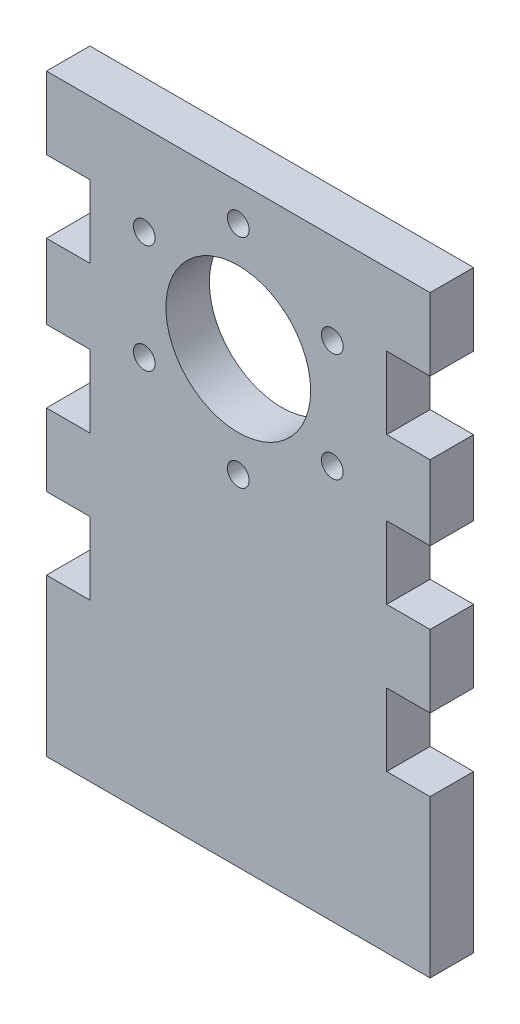
ISO-10303-21;
HEADER;
FILE_DESCRIPTION(('STEP AP214'),'2;1');
FILE_NAME('part.step','',(''),(''),'','','');
FILE_SCHEMA(('AUTOMOTIVE_DESIGN { 1 0 10303 214 1 1 1 1 }'));
ENDSEC;
DATA;
#1=APPLICATION_CONTEXT('core data for automotive mechanical design processes');
#2=APPLICATION_PROTOCOL_DEFINITION('international standard','automotive_design',2000,#1);
#3=PRODUCT_CONTEXT('',#1,'mechanical');
#4=PRODUCT('Part','Part','',(#3));
#5=PRODUCT_RELATED_PRODUCT_CATEGORY('part','',(#4));
#6=PRODUCT_DEFINITION_FORMATION('','',#4);
#7=PRODUCT_DEFINITION_CONTEXT('part definition',#1,'design');
#8=PRODUCT_DEFINITION('design','',#6,#7);
#9=PRODUCT_DEFINITION_SHAPE('','',#8);
#10=(LENGTH_UNIT() NAMED_UNIT(*) SI_UNIT(.MILLI.,.METRE.));
#11=(NAMED_UNIT(*) PLANE_ANGLE_UNIT() SI_UNIT($,.RADIAN.));
#12=(NAMED_UNIT(*) SI_UNIT($,.STERADIAN.) SOLID_ANGLE_UNIT());
#13=UNCERTAINTY_MEASURE_WITH_UNIT(LENGTH_MEASURE(1.E-05),#10,'distance_accuracy_value','');
#14=(GEOMETRIC_REPRESENTATION_CONTEXT(3) GLOBAL_UNCERTAINTY_ASSIGNED_CONTEXT((#13)) GLOBAL_UNIT_ASSIGNED_CONTEXT((#10,
#11,#12)) REPRESENTATION_CONTEXT('',''));
#15=CARTESIAN_POINT('',(0.,0.,0.));
#16=DIRECTION('',(0.,0.,1.));
#17=DIRECTION('',(1.,0.,0.));
#18=AXIS2_PLACEMENT_3D('',#15,#16,#17);
#19=CARTESIAN_POINT('',(0.,0.,3.));
#20=DIRECTION('',(0.,0.,1.));
#21=DIRECTION('',(1.,0.,0.));
#22=AXIS2_PLACEMENT_3D('',#19,#20,#21);
#23=PLANE('',#22);
#24=CARTESIAN_POINT('',(-6.49530237350615,6.75019372810737,3.));
#25=DIRECTION('',(0.,0.,1.));
#26=DIRECTION('',(1.,0.,0.));
#27=AXIS2_PLACEMENT_3D('',#24,#25,#26);
#28=CIRCLE('',#27,0.749999999999999);
#29=CARTESIAN_POINT('',(-5.74530237350615,6.75019372810737,3.));
#30=VERTEX_POINT('',#29);
#31=EDGE_CURVE('E510',#30,#30,#28,.T.);
#32=ORIENTED_EDGE('',*,*,#31,.F.);
#33=EDGE_LOOP('',(#32));
#34=FACE_BOUND('',#33,.T.);
#35=CARTESIAN_POINT('',(6.49519052838329,6.75,3.));
#36=DIRECTION('',(0.,0.,1.));
#37=DIRECTION('',(1.,0.,0.));
#38=AXIS2_PLACEMENT_3D('',#35,#36,#37);
#39=CIRCLE('',#38,0.750000000000005);
#40=CARTESIAN_POINT('',(7.24519052838329,6.75,3.));
#41=VERTEX_POINT('',#40);
#42=EDGE_CURVE('E522',#41,#41,#39,.T.);
#43=ORIENTED_EDGE('',*,*,#42,.F.);
#44=EDGE_LOOP('',(#43));
#45=FACE_BOUND('',#44,.T.);
#46=CARTESIAN_POINT('',(0.,18.,3.));
#47=DIRECTION('',(0.,0.,1.));
#48=DIRECTION('',(1.,0.,0.));
#49=AXIS2_PLACEMENT_3D('',#46,#47,#48);
#50=CIRCLE('',#49,0.750000000000002);
#51=CARTESIAN_POINT('',(0.750000000000002,18.,3.));
#52=VERTEX_POINT('',#51);
#53=EDGE_CURVE('E534',#52,#52,#50,.T.);
#54=ORIENTED_EDGE('',*,*,#53,.F.);
#55=EDGE_LOOP('',(#54));
#56=FACE_BOUND('',#55,.T.);
#57=DIRECTION('',(0.,1.,0.));
#58=VECTOR('',#57,1.);
#59=CARTESIAN_POINT('',(13.25,-9.65,3.));
#60=LINE('',#59,#58);
#61=CARTESIAN_POINT('',(13.25,-20.5,3.));
#62=VERTEX_POINT('',#61);
#63=CARTESIAN_POINT('',(13.25,-9.65,3.));
#64=VERTEX_POINT('',#63);
#65=EDGE_CURVE('E304',#62,#64,#60,.T.);
#66=ORIENTED_EDGE('',*,*,#65,.T.);
#67=DIRECTION('',(-1.,0.,0.));
#68=VECTOR('',#67,1.);
#69=CARTESIAN_POINT('',(10.25,-9.65000000000001,3.));
#70=LINE('',#69,#68);
#71=CARTESIAN_POINT('',(10.25,-9.65000000000001,3.));
#72=VERTEX_POINT('',#71);
#73=EDGE_CURVE('E152',#64,#72,#70,.T.);
#74=ORIENTED_EDGE('',*,*,#73,.T.);
#75=DIRECTION('',(0.,1.,0.));
#76=VECTOR('',#75,1.);
#77=CARTESIAN_POINT('',(10.25,-4.65,3.));
#78=LINE('',#77,#76);
#79=CARTESIAN_POINT('',(10.25,-4.65,3.));
#80=VERTEX_POINT('',#79);
#81=EDGE_CURVE('E379',#72,#80,#78,.T.);
#82=ORIENTED_EDGE('',*,*,#81,.T.);
#83=DIRECTION('',(1.,0.,0.));
#84=VECTOR('',#83,1.);
#85=CARTESIAN_POINT('',(13.25,-4.65,3.));
#86=LINE('',#85,#84);
#87=CARTESIAN_POINT('',(13.25,-4.65,3.));
#88=VERTEX_POINT('',#87);
#89=EDGE_CURVE('E398',#80,#88,#86,.T.);
#90=ORIENTED_EDGE('',*,*,#89,.T.);
#91=DIRECTION('',(0.,1.,0.));
#92=VECTOR('',#91,1.);
#93=CARTESIAN_POINT('',(13.25,0.349999999999997,3.));
#94=LINE('',#93,#92);
#95=CARTESIAN_POINT('',(13.25,0.349999999999997,3.));
#96=VERTEX_POINT('',#95);
#97=EDGE_CURVE('E395',#88,#96,#94,.T.);
#98=ORIENTED_EDGE('',*,*,#97,.T.);
#99=DIRECTION('',(-1.,0.,0.));
#100=VECTOR('',#99,1.);
#101=CARTESIAN_POINT('',(10.25,0.349999999999997,3.));
#102=LINE('',#101,#100);
#103=CARTESIAN_POINT('',(10.25,0.349999999999997,3.));
#104=VERTEX_POINT('',#103);
#105=EDGE_CURVE('E397',#96,#104,#102,.T.);
#106=ORIENTED_EDGE('',*,*,#105,.T.);
#107=DIRECTION('',(0.,1.,0.));
#108=VECTOR('',#107,1.);
#109=CARTESIAN_POINT('',(10.25,5.35,3.));
#110=LINE('',#109,#108);
#111=CARTESIAN_POINT('',(10.25,5.35,3.));
#112=VERTEX_POINT('',#111);
#113=EDGE_CURVE('E400',#104,#112,#110,.T.);
#114=ORIENTED_EDGE('',*,*,#113,.T.);
#115=DIRECTION('',(1.,0.,0.));
#116=VECTOR('',#115,1.);
#117=CARTESIAN_POINT('',(13.25,5.35,3.));
#118=LINE('',#117,#116);
#119=CARTESIAN_POINT('',(13.25,5.35,3.));
#120=VERTEX_POINT('',#119);
#121=EDGE_CURVE('E406',#112,#120,#118,.T.);
#122=ORIENTED_EDGE('',*,*,#121,.T.);
#123=DIRECTION('',(0.,1.,0.));
#124=VECTOR('',#123,1.);
#125=CARTESIAN_POINT('',(13.25,10.5,3.));
#126=LINE('',#125,#124);
#127=CARTESIAN_POINT('',(13.25,10.5,3.));
#128=VERTEX_POINT('',#127);
#129=EDGE_CURVE('E408',#120,#128,#126,.T.);
#130=ORIENTED_EDGE('',*,*,#129,.T.);
#131=DIRECTION('',(-1.,0.,0.));
#132=VECTOR('',#131,1.);
#133=CARTESIAN_POINT('',(10.25,10.5,3.));
#134=LINE('',#133,#132);
#135=CARTESIAN_POINT('',(10.25,10.5,3.));
#136=VERTEX_POINT('',#135);
#137=EDGE_CURVE('E410',#128,#136,#134,.T.);
#138=ORIENTED_EDGE('',*,*,#137,.T.);
#139=DIRECTION('',(0.,1.,0.));
#140=VECTOR('',#139,1.);
#141=CARTESIAN_POINT('',(10.25,15.5,3.));
#142=LINE('',#141,#140);
#143=CARTESIAN_POINT('',(10.25,15.5,3.));
#144=VERTEX_POINT('',#143);
#145=EDGE_CURVE('E412',#136,#144,#142,.T.);
#146=ORIENTED_EDGE('',*,*,#145,.T.);
#147=DIRECTION('',(1.,0.,0.));
#148=VECTOR('',#147,1.);
#149=CARTESIAN_POINT('',(13.25,15.5,3.));
#150=LINE('',#149,#148);
#151=CARTESIAN_POINT('',(13.25,15.5,3.));
#152=VERTEX_POINT('',#151);
#153=EDGE_CURVE('E414',#144,#152,#150,.T.);
#154=ORIENTED_EDGE('',*,*,#153,.T.);
#155=DIRECTION('',(0.,1.,0.));
#156=VECTOR('',#155,1.);
#157=CARTESIAN_POINT('',(13.25,20.5,3.));
#158=LINE('',#157,#156);
#159=CARTESIAN_POINT('',(13.25,20.5,3.));
#160=VERTEX_POINT('',#159);
#161=EDGE_CURVE('E416',#152,#160,#158,.T.);
#162=ORIENTED_EDGE('',*,*,#161,.T.);
#163=DIRECTION('',(-1.,0.,0.));
#164=VECTOR('',#163,1.);
#165=CARTESIAN_POINT('',(-13.25,20.5,3.));
#166=LINE('',#165,#164);
#167=CARTESIAN_POINT('',(-13.25,20.5,3.));
#168=VERTEX_POINT('',#167);
#169=EDGE_CURVE('E418',#160,#168,#166,.T.);
#170=ORIENTED_EDGE('',*,*,#169,.T.);
#171=DIRECTION('',(0.,-1.,0.));
#172=VECTOR('',#171,1.);
#173=CARTESIAN_POINT('',(-13.25,20.5,3.));
#174=LINE('',#173,#172);
#175=CARTESIAN_POINT('',(-13.25,15.5,3.));
#176=VERTEX_POINT('',#175);
#177=EDGE_CURVE('E420',#168,#176,#174,.T.);
#178=ORIENTED_EDGE('',*,*,#177,.T.);
#179=DIRECTION('',(1.,0.,0.));
#180=VECTOR('',#179,1.);
#181=CARTESIAN_POINT('',(-13.25,15.5,3.));
#182=LINE('',#181,#180);
#183=CARTESIAN_POINT('',(-10.25,15.5,3.));
#184=VERTEX_POINT('',#183);
#185=EDGE_CURVE('E422',#176,#184,#182,.T.);
#186=ORIENTED_EDGE('',*,*,#185,.T.);
#187=DIRECTION('',(0.,-1.,0.));
#188=VECTOR('',#187,1.);
#189=CARTESIAN_POINT('',(-10.25,15.5,3.));
#190=LINE('',#189,#188);
#191=CARTESIAN_POINT('',(-10.25,10.5,3.));
#192=VERTEX_POINT('',#191);
#193=EDGE_CURVE('E424',#184,#192,#190,.T.);
#194=ORIENTED_EDGE('',*,*,#193,.T.);
#195=DIRECTION('',(-1.,0.,0.));
#196=VECTOR('',#195,1.);
#197=CARTESIAN_POINT('',(-10.25,10.5,3.));
#198=LINE('',#197,#196);
#199=CARTESIAN_POINT('',(-13.25,10.5,3.));
#200=VERTEX_POINT('',#199);
#201=EDGE_CURVE('E426',#192,#200,#198,.T.);
#202=ORIENTED_EDGE('',*,*,#201,.T.);
#203=DIRECTION('',(0.,-1.,0.));
#204=VECTOR('',#203,1.);
#205=CARTESIAN_POINT('',(-13.25,10.5,3.));
#206=LINE('',#205,#204);
#207=CARTESIAN_POINT('',(-13.25,5.35,3.));
#208=VERTEX_POINT('',#207);
#209=EDGE_CURVE('E428',#200,#208,#206,.T.);
#210=ORIENTED_EDGE('',*,*,#209,.T.);
#211=DIRECTION('',(1.,0.,0.));
#212=VECTOR('',#211,1.);
#213=CARTESIAN_POINT('',(-13.25,5.35,3.));
#214=LINE('',#213,#212);
#215=CARTESIAN_POINT('',(-10.25,5.35,3.));
#216=VERTEX_POINT('',#215);
#217=EDGE_CURVE('E430',#208,#216,#214,.T.);
#218=ORIENTED_EDGE('',*,*,#217,.T.);
#219=DIRECTION('',(0.,-1.,0.));
#220=VECTOR('',#219,1.);
#221=CARTESIAN_POINT('',(-10.25,5.35,3.));
#222=LINE('',#221,#220);
#223=CARTESIAN_POINT('',(-10.25,0.349999999999994,3.));
#224=VERTEX_POINT('',#223);
#225=EDGE_CURVE('E432',#216,#224,#222,.T.);
#226=ORIENTED_EDGE('',*,*,#225,.T.);
#227=DIRECTION('',(-1.,0.,0.));
#228=VECTOR('',#227,1.);
#229=CARTESIAN_POINT('',(-10.25,0.349999999999994,3.));
#230=LINE('',#229,#228);
#231=CARTESIAN_POINT('',(-13.25,0.349999999999994,3.));
#232=VERTEX_POINT('',#231);
#233=EDGE_CURVE('E434',#224,#232,#230,.T.);
#234=ORIENTED_EDGE('',*,*,#233,.T.);
#235=DIRECTION('',(0.,-1.,0.));
#236=VECTOR('',#235,1.);
#237=CARTESIAN_POINT('',(-13.25,0.349999999999994,3.));
#238=LINE('',#237,#236);
#239=CARTESIAN_POINT('',(-13.25,-4.65000000000001,3.));
#240=VERTEX_POINT('',#239);
#241=EDGE_CURVE('E436',#232,#240,#238,.T.);
#242=ORIENTED_EDGE('',*,*,#241,.T.);
#243=DIRECTION('',(1.,0.,0.));
#244=VECTOR('',#243,1.);
#245=CARTESIAN_POINT('',(-13.25,-4.65000000000001,3.));
#246=LINE('',#245,#244);
#247=CARTESIAN_POINT('',(-10.25,-4.65000000000001,3.));
#248=VERTEX_POINT('',#247);
#249=EDGE_CURVE('E438',#240,#248,#246,.T.);
#250=ORIENTED_EDGE('',*,*,#249,.T.);
#251=DIRECTION('',(0.,-1.,0.));
#252=VECTOR('',#251,1.);
#253=CARTESIAN_POINT('',(-10.25,-4.65000000000001,3.));
#254=LINE('',#253,#252);
#255=CARTESIAN_POINT('',(-10.25,-9.65000000000001,3.));
#256=VERTEX_POINT('',#255);
#257=EDGE_CURVE('E231',#248,#256,#254,.T.);
#258=ORIENTED_EDGE('',*,*,#257,.T.);
#259=DIRECTION('',(-1.,0.,0.));
#260=VECTOR('',#259,1.);
#261=CARTESIAN_POINT('',(-10.25,-9.65000000000001,3.));
#262=LINE('',#261,#260);
#263=CARTESIAN_POINT('',(-13.25,-9.65000000000001,3.));
#264=VERTEX_POINT('',#263);
#265=EDGE_CURVE('E225',#256,#264,#262,.T.);
#266=ORIENTED_EDGE('',*,*,#265,.T.);
#267=DIRECTION('',(0.,-1.,0.));
#268=VECTOR('',#267,1.);
#269=CARTESIAN_POINT('',(-13.25,-9.65000000000001,3.));
#270=LINE('',#269,#268);
#271=CARTESIAN_POINT('',(-13.25,-20.5,3.));
#272=VERTEX_POINT('',#271);
#273=EDGE_CURVE('E229',#264,#272,#270,.T.);
#274=ORIENTED_EDGE('',*,*,#273,.T.);
#275=DIRECTION('',(1.,0.,0.));
#276=VECTOR('',#275,1.);
#277=CARTESIAN_POINT('',(-13.25,-20.5,3.));
#278=LINE('',#277,#276);
#279=EDGE_CURVE('E49',#272,#62,#278,.T.);
#280=ORIENTED_EDGE('',*,*,#279,.T.);
#281=EDGE_LOOP('',(#66,#74,#82,#90,#98,#106,#114,#122,#130,#138,#146,#154,#162,#170,#178,#186,
#194,#202,#210,#218,#226,#234,#242,#250,#258,#266,#274,#280));
#282=FACE_BOUND('',#281,.T.);
#283=CARTESIAN_POINT('',(0.,10.5,3.));
#284=DIRECTION('',(0.,0.,1.));
#285=DIRECTION('',(1.,0.,0.));
#286=AXIS2_PLACEMENT_3D('',#283,#284,#285);
#287=CIRCLE('',#286,5.);
#288=CARTESIAN_POINT('',(5.,10.5,3.));
#289=VERTEX_POINT('',#288);
#290=EDGE_CURVE('E253',#289,#289,#287,.T.);
#291=ORIENTED_EDGE('',*,*,#290,.F.);
#292=EDGE_LOOP('',(#291));
#293=FACE_BOUND('',#292,.T.);
#294=CARTESIAN_POINT('',(6.49530237350615,14.2498062718926,3.));
#295=DIRECTION('',(0.,0.,1.));
#296=DIRECTION('',(1.,0.,0.));
#297=AXIS2_PLACEMENT_3D('',#294,#295,#296);
#298=CIRCLE('',#297,0.750000000000002);
#299=CARTESIAN_POINT('',(7.24530237350616,14.2498062718926,3.));
#300=VERTEX_POINT('',#299);
#301=EDGE_CURVE('E528',#300,#300,#298,.T.);
#302=ORIENTED_EDGE('',*,*,#301,.F.);
#303=EDGE_LOOP('',(#302));
#304=FACE_BOUND('',#303,.T.);
#305=CARTESIAN_POINT('',(0.,3.,3.));
#306=DIRECTION('',(0.,0.,1.));
#307=DIRECTION('',(1.,0.,0.));
#308=AXIS2_PLACEMENT_3D('',#305,#306,#307);
#309=CIRCLE('',#308,0.750000000000002);
#310=CARTESIAN_POINT('',(0.750000000000004,3.,3.));
#311=VERTEX_POINT('',#310);
#312=EDGE_CURVE('E516',#311,#311,#309,.T.);
#313=ORIENTED_EDGE('',*,*,#312,.F.);
#314=EDGE_LOOP('',(#313));
#315=FACE_BOUND('',#314,.T.);
#316=CARTESIAN_POINT('',(-6.49519052838329,14.25,3.));
#317=DIRECTION('',(0.,0.,1.));
#318=DIRECTION('',(1.,0.,0.));
#319=AXIS2_PLACEMENT_3D('',#316,#317,#318);
#320=CIRCLE('',#319,0.750000000000002);
#321=CARTESIAN_POINT('',(-5.74519052838329,14.25,3.));
#322=VERTEX_POINT('',#321);
#323=EDGE_CURVE('E501',#322,#322,#320,.T.);
#324=ORIENTED_EDGE('',*,*,#323,.F.);
#325=EDGE_LOOP('',(#324));
#326=FACE_BOUND('',#325,.T.);
#327=ADVANCED_FACE('F32',(#34,#45,#56,#282,#293,#304,#315,#326),#23,.T.);
#328=CARTESIAN_POINT('',(0.,0.,0.));
#329=DIRECTION('',(0.,0.,1.));
#330=DIRECTION('',(1.,0.,0.));
#331=AXIS2_PLACEMENT_3D('',#328,#329,#330);
#332=PLANE('',#331);
#333=DIRECTION('',(0.,1.,0.));
#334=VECTOR('',#333,1.);
#335=CARTESIAN_POINT('',(13.25,-9.65,0.));
#336=LINE('',#335,#334);
#337=CARTESIAN_POINT('',(13.25,-20.5,0.));
#338=VERTEX_POINT('',#337);
#339=CARTESIAN_POINT('',(13.25,-9.65,0.));
#340=VERTEX_POINT('',#339);
#341=EDGE_CURVE('E249',#338,#340,#336,.T.);
#342=ORIENTED_EDGE('',*,*,#341,.F.);
#343=DIRECTION('',(1.,0.,0.));
#344=VECTOR('',#343,1.);
#345=CARTESIAN_POINT('',(-13.25,-20.5,0.));
#346=LINE('',#345,#344);
#347=CARTESIAN_POINT('',(-13.25,-20.5,0.));
#348=VERTEX_POINT('',#347);
#349=EDGE_CURVE('E144',#348,#338,#346,.T.);
#350=ORIENTED_EDGE('',*,*,#349,.F.);
#351=DIRECTION('',(0.,-1.,0.));
#352=VECTOR('',#351,1.);
#353=CARTESIAN_POINT('',(-13.25,-9.65000000000001,0.));
#354=LINE('',#353,#352);
#355=CARTESIAN_POINT('',(-13.25,-9.65000000000001,0.));
#356=VERTEX_POINT('',#355);
#357=EDGE_CURVE('E138',#356,#348,#354,.T.);
#358=ORIENTED_EDGE('',*,*,#357,.F.);
#359=DIRECTION('',(-1.,0.,0.));
#360=VECTOR('',#359,1.);
#361=CARTESIAN_POINT('',(-10.25,-9.65000000000001,0.));
#362=LINE('',#361,#360);
#363=CARTESIAN_POINT('',(-10.25,-9.65000000000001,0.));
#364=VERTEX_POINT('',#363);
#365=EDGE_CURVE('E239',#364,#356,#362,.T.);
#366=ORIENTED_EDGE('',*,*,#365,.F.);
#367=DIRECTION('',(0.,-1.,0.));
#368=VECTOR('',#367,1.);
#369=CARTESIAN_POINT('',(-10.25,-4.65000000000001,0.));
#370=LINE('',#369,#368);
#371=CARTESIAN_POINT('',(-10.25,-4.65000000000001,0.));
#372=VERTEX_POINT('',#371);
#373=EDGE_CURVE('E299',#372,#364,#370,.T.);
#374=ORIENTED_EDGE('',*,*,#373,.F.);
#375=DIRECTION('',(1.,0.,0.));
#376=VECTOR('',#375,1.);
#377=CARTESIAN_POINT('',(-13.25,-4.65000000000001,0.));
#378=LINE('',#377,#376);
#379=CARTESIAN_POINT('',(-13.25,-4.65000000000001,0.));
#380=VERTEX_POINT('',#379);
#381=EDGE_CURVE('E297',#380,#372,#378,.T.);
#382=ORIENTED_EDGE('',*,*,#381,.F.);
#383=DIRECTION('',(0.,-1.,0.));
#384=VECTOR('',#383,1.);
#385=CARTESIAN_POINT('',(-13.25,0.349999999999994,0.));
#386=LINE('',#385,#384);
#387=CARTESIAN_POINT('',(-13.25,0.349999999999994,0.));
#388=VERTEX_POINT('',#387);
#389=EDGE_CURVE('E295',#388,#380,#386,.T.);
#390=ORIENTED_EDGE('',*,*,#389,.F.);
#391=DIRECTION('',(-1.,0.,0.));
#392=VECTOR('',#391,1.);
#393=CARTESIAN_POINT('',(-10.25,0.349999999999994,0.));
#394=LINE('',#393,#392);
#395=CARTESIAN_POINT('',(-10.25,0.349999999999994,0.));
#396=VERTEX_POINT('',#395);
#397=EDGE_CURVE('E293',#396,#388,#394,.T.);
#398=ORIENTED_EDGE('',*,*,#397,.F.);
#399=DIRECTION('',(0.,-1.,0.));
#400=VECTOR('',#399,1.);
#401=CARTESIAN_POINT('',(-10.25,5.35,0.));
#402=LINE('',#401,#400);
#403=CARTESIAN_POINT('',(-10.25,5.35,0.));
#404=VERTEX_POINT('',#403);
#405=EDGE_CURVE('E291',#404,#396,#402,.T.);
#406=ORIENTED_EDGE('',*,*,#405,.F.);
#407=DIRECTION('',(1.,0.,0.));
#408=VECTOR('',#407,1.);
#409=CARTESIAN_POINT('',(-13.25,5.35,0.));
#410=LINE('',#409,#408);
#411=CARTESIAN_POINT('',(-13.25,5.35,0.));
#412=VERTEX_POINT('',#411);
#413=EDGE_CURVE('E289',#412,#404,#410,.T.);
#414=ORIENTED_EDGE('',*,*,#413,.F.);
#415=DIRECTION('',(0.,-1.,0.));
#416=VECTOR('',#415,1.);
#417=CARTESIAN_POINT('',(-13.25,10.5,0.));
#418=LINE('',#417,#416);
#419=CARTESIAN_POINT('',(-13.25,10.5,0.));
#420=VERTEX_POINT('',#419);
#421=EDGE_CURVE('E287',#420,#412,#418,.T.);
#422=ORIENTED_EDGE('',*,*,#421,.F.);
#423=DIRECTION('',(-1.,0.,0.));
#424=VECTOR('',#423,1.);
#425=CARTESIAN_POINT('',(-10.25,10.5,0.));
#426=LINE('',#425,#424);
#427=CARTESIAN_POINT('',(-10.25,10.5,0.));
#428=VERTEX_POINT('',#427);
#429=EDGE_CURVE('E285',#428,#420,#426,.T.);
#430=ORIENTED_EDGE('',*,*,#429,.F.);
#431=DIRECTION('',(0.,-1.,0.));
#432=VECTOR('',#431,1.);
#433=CARTESIAN_POINT('',(-10.25,15.5,0.));
#434=LINE('',#433,#432);
#435=CARTESIAN_POINT('',(-10.25,15.5,0.));
#436=VERTEX_POINT('',#435);
#437=EDGE_CURVE('E283',#436,#428,#434,.T.);
#438=ORIENTED_EDGE('',*,*,#437,.F.);
#439=DIRECTION('',(1.,0.,0.));
#440=VECTOR('',#439,1.);
#441=CARTESIAN_POINT('',(-13.25,15.5,0.));
#442=LINE('',#441,#440);
#443=CARTESIAN_POINT('',(-13.25,15.5,0.));
#444=VERTEX_POINT('',#443);
#445=EDGE_CURVE('E281',#444,#436,#442,.T.);
#446=ORIENTED_EDGE('',*,*,#445,.F.);
#447=DIRECTION('',(0.,-1.,0.));
#448=VECTOR('',#447,1.);
#449=CARTESIAN_POINT('',(-13.25,20.5,0.));
#450=LINE('',#449,#448);
#451=CARTESIAN_POINT('',(-13.25,20.5,0.));
#452=VERTEX_POINT('',#451);
#453=EDGE_CURVE('E279',#452,#444,#450,.T.);
#454=ORIENTED_EDGE('',*,*,#453,.F.);
#455=DIRECTION('',(-1.,0.,0.));
#456=VECTOR('',#455,1.);
#457=CARTESIAN_POINT('',(-13.25,20.5,0.));
#458=LINE('',#457,#456);
#459=CARTESIAN_POINT('',(13.25,20.5,0.));
#460=VERTEX_POINT('',#459);
#461=EDGE_CURVE('E277',#460,#452,#458,.T.);
#462=ORIENTED_EDGE('',*,*,#461,.F.);
#463=DIRECTION('',(0.,1.,0.));
#464=VECTOR('',#463,1.);
#465=CARTESIAN_POINT('',(13.25,20.5,0.));
#466=LINE('',#465,#464);
#467=CARTESIAN_POINT('',(13.25,15.5,0.));
#468=VERTEX_POINT('',#467);
#469=EDGE_CURVE('E275',#468,#460,#466,.T.);
#470=ORIENTED_EDGE('',*,*,#469,.F.);
#471=DIRECTION('',(1.,0.,0.));
#472=VECTOR('',#471,1.);
#473=CARTESIAN_POINT('',(13.25,15.5,0.));
#474=LINE('',#473,#472);
#475=CARTESIAN_POINT('',(10.25,15.5,0.));
#476=VERTEX_POINT('',#475);
#477=EDGE_CURVE('E273',#476,#468,#474,.T.);
#478=ORIENTED_EDGE('',*,*,#477,.F.);
#479=DIRECTION('',(0.,1.,0.));
#480=VECTOR('',#479,1.);
#481=CARTESIAN_POINT('',(10.25,15.5,0.));
#482=LINE('',#481,#480);
#483=CARTESIAN_POINT('',(10.25,10.5,0.));
#484=VERTEX_POINT('',#483);
#485=EDGE_CURVE('E271',#484,#476,#482,.T.);
#486=ORIENTED_EDGE('',*,*,#485,.F.);
#487=DIRECTION('',(-1.,0.,0.));
#488=VECTOR('',#487,1.);
#489=CARTESIAN_POINT('',(10.25,10.5,0.));
#490=LINE('',#489,#488);
#491=CARTESIAN_POINT('',(13.25,10.5,0.));
#492=VERTEX_POINT('',#491);
#493=EDGE_CURVE('E269',#492,#484,#490,.T.);
#494=ORIENTED_EDGE('',*,*,#493,.F.);
#495=DIRECTION('',(0.,1.,0.));
#496=VECTOR('',#495,1.);
#497=CARTESIAN_POINT('',(13.25,10.5,0.));
#498=LINE('',#497,#496);
#499=CARTESIAN_POINT('',(13.25,5.35,0.));
#500=VERTEX_POINT('',#499);
#501=EDGE_CURVE('E267',#500,#492,#498,.T.);
#502=ORIENTED_EDGE('',*,*,#501,.F.);
#503=DIRECTION('',(1.,0.,0.));
#504=VECTOR('',#503,1.);
#505=CARTESIAN_POINT('',(13.25,5.35,0.));
#506=LINE('',#505,#504);
#507=CARTESIAN_POINT('',(10.25,5.35,0.));
#508=VERTEX_POINT('',#507);
#509=EDGE_CURVE('E265',#508,#500,#506,.T.);
#510=ORIENTED_EDGE('',*,*,#509,.F.);
#511=DIRECTION('',(0.,1.,0.));
#512=VECTOR('',#511,1.);
#513=CARTESIAN_POINT('',(10.25,5.35,0.));
#514=LINE('',#513,#512);
#515=CARTESIAN_POINT('',(10.25,0.349999999999997,0.));
#516=VERTEX_POINT('',#515);
#517=EDGE_CURVE('E263',#516,#508,#514,.T.);
#518=ORIENTED_EDGE('',*,*,#517,.F.);
#519=DIRECTION('',(-1.,0.,0.));
#520=VECTOR('',#519,1.);
#521=CARTESIAN_POINT('',(10.25,0.349999999999997,0.));
#522=LINE('',#521,#520);
#523=CARTESIAN_POINT('',(13.25,0.349999999999997,0.));
#524=VERTEX_POINT('',#523);
#525=EDGE_CURVE('E261',#524,#516,#522,.T.);
#526=ORIENTED_EDGE('',*,*,#525,.F.);
#527=DIRECTION('',(0.,1.,0.));
#528=VECTOR('',#527,1.);
#529=CARTESIAN_POINT('',(13.25,0.349999999999997,0.));
#530=LINE('',#529,#528);
#531=CARTESIAN_POINT('',(13.25,-4.65,0.));
#532=VERTEX_POINT('',#531);
#533=EDGE_CURVE('E259',#532,#524,#530,.T.);
#534=ORIENTED_EDGE('',*,*,#533,.F.);
#535=DIRECTION('',(1.,0.,0.));
#536=VECTOR('',#535,1.);
#537=CARTESIAN_POINT('',(13.25,-4.65,0.));
#538=LINE('',#537,#536);
#539=CARTESIAN_POINT('',(10.25,-4.65,0.));
#540=VERTEX_POINT('',#539);
#541=EDGE_CURVE('E257',#540,#532,#538,.T.);
#542=ORIENTED_EDGE('',*,*,#541,.F.);
#543=DIRECTION('',(0.,1.,0.));
#544=VECTOR('',#543,1.);
#545=CARTESIAN_POINT('',(10.25,-4.65,0.));
#546=LINE('',#545,#544);
#547=CARTESIAN_POINT('',(10.25,-9.65000000000001,0.));
#548=VERTEX_POINT('',#547);
#549=EDGE_CURVE('E255',#548,#540,#546,.T.);
#550=ORIENTED_EDGE('',*,*,#549,.F.);
#551=DIRECTION('',(-1.,0.,0.));
#552=VECTOR('',#551,1.);
#553=CARTESIAN_POINT('',(10.25,-9.65000000000001,0.));
#554=LINE('',#553,#552);
#555=EDGE_CURVE('E252',#340,#548,#554,.T.);
#556=ORIENTED_EDGE('',*,*,#555,.F.);
#557=EDGE_LOOP('',(#342,#350,#358,#366,#374,#382,#390,#398,#406,#414,#422,#430,#438,#446,#454,
#462,#470,#478,#486,#494,#502,#510,#518,#526,#534,#542,#550,#556));
#558=FACE_BOUND('',#557,.T.);
#559=CARTESIAN_POINT('',(0.,10.5,0.));
#560=DIRECTION('',(0.,0.,1.));
#561=DIRECTION('',(1.,0.,0.));
#562=AXIS2_PLACEMENT_3D('',#559,#560,#561);
#563=CIRCLE('',#562,5.);
#564=CARTESIAN_POINT('',(5.,10.5,0.));
#565=VERTEX_POINT('',#564);
#566=EDGE_CURVE('E537',#565,#565,#563,.T.);
#567=ORIENTED_EDGE('',*,*,#566,.T.);
#568=EDGE_LOOP('',(#567));
#569=FACE_BOUND('',#568,.T.);
#570=CARTESIAN_POINT('',(0.,18.,0.));
#571=DIRECTION('',(0.,0.,1.));
#572=DIRECTION('',(1.,0.,0.));
#573=AXIS2_PLACEMENT_3D('',#570,#571,#572);
#574=CIRCLE('',#573,0.750000000000002);
#575=CARTESIAN_POINT('',(0.750000000000002,18.,0.));
#576=VERTEX_POINT('',#575);
#577=EDGE_CURVE('E531',#576,#576,#574,.T.);
#578=ORIENTED_EDGE('',*,*,#577,.T.);
#579=EDGE_LOOP('',(#578));
#580=FACE_BOUND('',#579,.T.);
#581=CARTESIAN_POINT('',(6.49530237350615,14.2498062718926,0.));
#582=DIRECTION('',(0.,0.,1.));
#583=DIRECTION('',(1.,0.,0.));
#584=AXIS2_PLACEMENT_3D('',#581,#582,#583);
#585=CIRCLE('',#584,0.750000000000002);
#586=CARTESIAN_POINT('',(7.24530237350616,14.2498062718926,0.));
#587=VERTEX_POINT('',#586);
#588=EDGE_CURVE('E525',#587,#587,#585,.T.);
#589=ORIENTED_EDGE('',*,*,#588,.T.);
#590=EDGE_LOOP('',(#589));
#591=FACE_BOUND('',#590,.T.);
#592=CARTESIAN_POINT('',(6.49519052838329,6.75,0.));
#593=DIRECTION('',(0.,0.,1.));
#594=DIRECTION('',(1.,0.,0.));
#595=AXIS2_PLACEMENT_3D('',#592,#593,#594);
#596=CIRCLE('',#595,0.750000000000005);
#597=CARTESIAN_POINT('',(7.24519052838329,6.75,0.));
#598=VERTEX_POINT('',#597);
#599=EDGE_CURVE('E519',#598,#598,#596,.T.);
#600=ORIENTED_EDGE('',*,*,#599,.T.);
#601=EDGE_LOOP('',(#600));
#602=FACE_BOUND('',#601,.T.);
#603=CARTESIAN_POINT('',(0.,3.,0.));
#604=DIRECTION('',(0.,0.,1.));
#605=DIRECTION('',(1.,0.,0.));
#606=AXIS2_PLACEMENT_3D('',#603,#604,#605);
#607=CIRCLE('',#606,0.750000000000002);
#608=CARTESIAN_POINT('',(0.750000000000004,3.,0.));
#609=VERTEX_POINT('',#608);
#610=EDGE_CURVE('E513',#609,#609,#607,.T.);
#611=ORIENTED_EDGE('',*,*,#610,.T.);
#612=EDGE_LOOP('',(#611));
#613=FACE_BOUND('',#612,.T.);
#614=CARTESIAN_POINT('',(-6.49530237350615,6.75019372810737,0.));
#615=DIRECTION('',(0.,0.,1.));
#616=DIRECTION('',(1.,0.,0.));
#617=AXIS2_PLACEMENT_3D('',#614,#615,#616);
#618=CIRCLE('',#617,0.749999999999999);
#619=CARTESIAN_POINT('',(-5.74530237350615,6.75019372810737,0.));
#620=VERTEX_POINT('',#619);
#621=EDGE_CURVE('E507',#620,#620,#618,.T.);
#622=ORIENTED_EDGE('',*,*,#621,.T.);
#623=EDGE_LOOP('',(#622));
#624=FACE_BOUND('',#623,.T.);
#625=CARTESIAN_POINT('',(-6.49519052838329,14.25,0.));
#626=DIRECTION('',(0.,0.,1.));
#627=DIRECTION('',(1.,0.,0.));
#628=AXIS2_PLACEMENT_3D('',#625,#626,#627);
#629=CIRCLE('',#628,0.750000000000002);
#630=CARTESIAN_POINT('',(-5.74519052838329,14.25,0.));
#631=VERTEX_POINT('',#630);
#632=EDGE_CURVE('E504',#631,#631,#629,.T.);
#633=ORIENTED_EDGE('',*,*,#632,.T.);
#634=EDGE_LOOP('',(#633));
#635=FACE_BOUND('',#634,.T.);
#636=ADVANCED_FACE('F383',(#558,#569,#580,#591,#602,#613,#624,#635),#332,.F.);
#637=CARTESIAN_POINT('',(13.25,-9.65,3.));
#638=DIRECTION('',(-1.,0.,0.));
#639=DIRECTION('',(0.,0.,1.));
#640=AXIS2_PLACEMENT_3D('',#637,#638,#639);
#641=PLANE('',#640);
#642=ORIENTED_EDGE('',*,*,#341,.T.);
#643=DIRECTION('',(0.,0.,-1.));
#644=VECTOR('',#643,1.);
#645=CARTESIAN_POINT('',(13.25,-9.65,3.));
#646=LINE('',#645,#644);
#647=EDGE_CURVE('E11',#64,#340,#646,.T.);
#648=ORIENTED_EDGE('',*,*,#647,.F.);
#649=ORIENTED_EDGE('',*,*,#65,.F.);
#650=DIRECTION('',(0.,0.,-1.));
#651=VECTOR('',#650,1.);
#652=CARTESIAN_POINT('',(13.25,-20.5,3.));
#653=LINE('',#652,#651);
#654=EDGE_CURVE('E245',#62,#338,#653,.T.);
#655=ORIENTED_EDGE('',*,*,#654,.T.);
#656=EDGE_LOOP('',(#642,#648,#649,#655));
#657=FACE_BOUND('',#656,.T.);
#658=ADVANCED_FACE('F34',(#657),#641,.F.);
#659=CARTESIAN_POINT('',(10.25,-9.65000000000001,3.));
#660=DIRECTION('',(0.,-1.,0.));
#661=DIRECTION('',(1.,0.,0.));
#662=AXIS2_PLACEMENT_3D('',#659,#660,#661);
#663=PLANE('',#662);
#664=ORIENTED_EDGE('',*,*,#555,.T.);
#665=DIRECTION('',(0.,0.,-1.));
#666=VECTOR('',#665,1.);
#667=CARTESIAN_POINT('',(10.25,-9.65000000000001,3.));
#668=LINE('',#667,#666);
#669=EDGE_CURVE('E41',#72,#548,#668,.T.);
#670=ORIENTED_EDGE('',*,*,#669,.F.);
#671=ORIENTED_EDGE('',*,*,#73,.F.);
#672=ORIENTED_EDGE('',*,*,#647,.T.);
#673=EDGE_LOOP('',(#664,#670,#671,#672));
#674=FACE_BOUND('',#673,.T.);
#675=ADVANCED_FACE('F834',(#674),#663,.F.);
#676=CARTESIAN_POINT('',(10.25,-4.65,3.));
#677=DIRECTION('',(-1.,0.,0.));
#678=DIRECTION('',(0.,0.,1.));
#679=AXIS2_PLACEMENT_3D('',#676,#677,#678);
#680=PLANE('',#679);
#681=ORIENTED_EDGE('',*,*,#549,.T.);
#682=DIRECTION('',(0.,0.,-1.));
#683=VECTOR('',#682,1.);
#684=CARTESIAN_POINT('',(10.25,-4.65,3.));
#685=LINE('',#684,#683);
#686=EDGE_CURVE('E371',#80,#540,#685,.T.);
#687=ORIENTED_EDGE('',*,*,#686,.F.);
#688=ORIENTED_EDGE('',*,*,#81,.F.);
#689=ORIENTED_EDGE('',*,*,#669,.T.);
#690=EDGE_LOOP('',(#681,#687,#688,#689));
#691=FACE_BOUND('',#690,.T.);
#692=ADVANCED_FACE('F377',(#691),#680,.F.);
#693=CARTESIAN_POINT('',(13.25,-4.65,3.));
#694=DIRECTION('',(0.,1.,0.));
#695=DIRECTION('',(-1.,0.,0.));
#696=AXIS2_PLACEMENT_3D('',#693,#694,#695);
#697=PLANE('',#696);
#698=ORIENTED_EDGE('',*,*,#541,.T.);
#699=DIRECTION('',(0.,0.,-1.));
#700=VECTOR('',#699,1.);
#701=CARTESIAN_POINT('',(13.25,-4.65,3.));
#702=LINE('',#701,#700);
#703=EDGE_CURVE('E368',#88,#532,#702,.T.);
#704=ORIENTED_EDGE('',*,*,#703,.F.);
#705=ORIENTED_EDGE('',*,*,#89,.F.);
#706=ORIENTED_EDGE('',*,*,#686,.T.);
#707=EDGE_LOOP('',(#698,#704,#705,#706));
#708=FACE_BOUND('',#707,.T.);
#709=ADVANCED_FACE('F389',(#708),#697,.F.);
#710=CARTESIAN_POINT('',(13.25,0.349999999999997,3.));
#711=DIRECTION('',(-1.,0.,0.));
#712=DIRECTION('',(0.,-1.,0.));
#713=AXIS2_PLACEMENT_3D('',#710,#711,#712);
#714=PLANE('',#713);
#715=ORIENTED_EDGE('',*,*,#533,.T.);
#716=DIRECTION('',(0.,0.,-1.));
#717=VECTOR('',#716,1.);
#718=CARTESIAN_POINT('',(13.25,0.349999999999997,3.));
#719=LINE('',#718,#717);
#720=EDGE_CURVE('E365',#96,#524,#719,.T.);
#721=ORIENTED_EDGE('',*,*,#720,.F.);
#722=ORIENTED_EDGE('',*,*,#97,.F.);
#723=ORIENTED_EDGE('',*,*,#703,.T.);
#724=EDGE_LOOP('',(#715,#721,#722,#723));
#725=FACE_BOUND('',#724,.T.);
#726=ADVANCED_FACE('F393',(#725),#714,.F.);
#727=CARTESIAN_POINT('',(10.25,0.349999999999997,3.));
#728=DIRECTION('',(0.,-1.,0.));
#729=DIRECTION('',(1.,0.,0.));
#730=AXIS2_PLACEMENT_3D('',#727,#728,#729);
#731=PLANE('',#730);
#732=ORIENTED_EDGE('',*,*,#525,.T.);
#733=DIRECTION('',(0.,0.,-1.));
#734=VECTOR('',#733,1.);
#735=CARTESIAN_POINT('',(10.25,0.349999999999997,3.));
#736=LINE('',#735,#734);
#737=EDGE_CURVE('E362',#104,#516,#736,.T.);
#738=ORIENTED_EDGE('',*,*,#737,.F.);
#739=ORIENTED_EDGE('',*,*,#105,.F.);
#740=ORIENTED_EDGE('',*,*,#720,.T.);
#741=EDGE_LOOP('',(#732,#738,#739,#740));
#742=FACE_BOUND('',#741,.T.);
#743=ADVANCED_FACE('F799',(#742),#731,.F.);
#744=CARTESIAN_POINT('',(10.25,5.35,3.));
#745=DIRECTION('',(-1.,0.,0.));
#746=DIRECTION('',(0.,-1.,0.));
#747=AXIS2_PLACEMENT_3D('',#744,#745,#746);
#748=PLANE('',#747);
#749=ORIENTED_EDGE('',*,*,#517,.T.);
#750=DIRECTION('',(0.,0.,-1.));
#751=VECTOR('',#750,1.);
#752=CARTESIAN_POINT('',(10.25,5.35,3.));
#753=LINE('',#752,#751);
#754=EDGE_CURVE('E359',#112,#508,#753,.T.);
#755=ORIENTED_EDGE('',*,*,#754,.F.);
#756=ORIENTED_EDGE('',*,*,#113,.F.);
#757=ORIENTED_EDGE('',*,*,#737,.T.);
#758=EDGE_LOOP('',(#749,#755,#756,#757));
#759=FACE_BOUND('',#758,.T.);
#760=ADVANCED_FACE('F789',(#759),#748,.F.);
#761=CARTESIAN_POINT('',(13.25,5.35,3.));
#762=DIRECTION('',(0.,1.,0.));
#763=DIRECTION('',(-1.,0.,0.));
#764=AXIS2_PLACEMENT_3D('',#761,#762,#763);
#765=PLANE('',#764);
#766=ORIENTED_EDGE('',*,*,#509,.T.);
#767=DIRECTION('',(0.,0.,-1.));
#768=VECTOR('',#767,1.);
#769=CARTESIAN_POINT('',(13.25,5.35,3.));
#770=LINE('',#769,#768);
#771=EDGE_CURVE('E356',#120,#500,#770,.T.);
#772=ORIENTED_EDGE('',*,*,#771,.F.);
#773=ORIENTED_EDGE('',*,*,#121,.F.);
#774=ORIENTED_EDGE('',*,*,#754,.T.);
#775=EDGE_LOOP('',(#766,#772,#773,#774));
#776=FACE_BOUND('',#775,.T.);
#777=ADVANCED_FACE('F779',(#776),#765,.F.);
#778=CARTESIAN_POINT('',(13.25,10.5,3.));
#779=DIRECTION('',(-1.,0.,0.));
#780=DIRECTION('',(0.,0.,1.));
#781=AXIS2_PLACEMENT_3D('',#778,#779,#780);
#782=PLANE('',#781);
#783=ORIENTED_EDGE('',*,*,#501,.T.);
#784=DIRECTION('',(0.,0.,-1.));
#785=VECTOR('',#784,1.);
#786=CARTESIAN_POINT('',(13.25,10.5,3.));
#787=LINE('',#786,#785);
#788=EDGE_CURVE('E353',#128,#492,#787,.T.);
#789=ORIENTED_EDGE('',*,*,#788,.F.);
#790=ORIENTED_EDGE('',*,*,#129,.F.);
#791=ORIENTED_EDGE('',*,*,#771,.T.);
#792=EDGE_LOOP('',(#783,#789,#790,#791));
#793=FACE_BOUND('',#792,.T.);
#794=ADVANCED_FACE('F769',(#793),#782,.F.);
#795=CARTESIAN_POINT('',(10.25,10.5,3.));
#796=DIRECTION('',(0.,-1.,0.));
#797=DIRECTION('',(1.,0.,0.));
#798=AXIS2_PLACEMENT_3D('',#795,#796,#797);
#799=PLANE('',#798);
#800=ORIENTED_EDGE('',*,*,#493,.T.);
#801=DIRECTION('',(0.,0.,-1.));
#802=VECTOR('',#801,1.);
#803=CARTESIAN_POINT('',(10.25,10.5,3.));
#804=LINE('',#803,#802);
#805=EDGE_CURVE('E350',#136,#484,#804,.T.);
#806=ORIENTED_EDGE('',*,*,#805,.F.);
#807=ORIENTED_EDGE('',*,*,#137,.F.);
#808=ORIENTED_EDGE('',*,*,#788,.T.);
#809=EDGE_LOOP('',(#800,#806,#807,#808));
#810=FACE_BOUND('',#809,.T.);
#811=ADVANCED_FACE('F759',(#810),#799,.F.);
#812=CARTESIAN_POINT('',(10.25,15.5,3.));
#813=DIRECTION('',(-1.,0.,0.));
#814=DIRECTION('',(0.,-1.,0.));
#815=AXIS2_PLACEMENT_3D('',#812,#813,#814);
#816=PLANE('',#815);
#817=ORIENTED_EDGE('',*,*,#485,.T.);
#818=DIRECTION('',(0.,0.,-1.));
#819=VECTOR('',#818,1.);
#820=CARTESIAN_POINT('',(10.25,15.5,3.));
#821=LINE('',#820,#819);
#822=EDGE_CURVE('E347',#144,#476,#821,.T.);
#823=ORIENTED_EDGE('',*,*,#822,.F.);
#824=ORIENTED_EDGE('',*,*,#145,.F.);
#825=ORIENTED_EDGE('',*,*,#805,.T.);
#826=EDGE_LOOP('',(#817,#823,#824,#825));
#827=FACE_BOUND('',#826,.T.);
#828=ADVANCED_FACE('F749',(#827),#816,.F.);
#829=CARTESIAN_POINT('',(13.25,15.5,3.));
#830=DIRECTION('',(0.,1.,0.));
#831=DIRECTION('',(-1.,0.,0.));
#832=AXIS2_PLACEMENT_3D('',#829,#830,#831);
#833=PLANE('',#832);
#834=ORIENTED_EDGE('',*,*,#477,.T.);
#835=DIRECTION('',(0.,0.,-1.));
#836=VECTOR('',#835,1.);
#837=CARTESIAN_POINT('',(13.25,15.5,3.));
#838=LINE('',#837,#836);
#839=EDGE_CURVE('E344',#152,#468,#838,.T.);
#840=ORIENTED_EDGE('',*,*,#839,.F.);
#841=ORIENTED_EDGE('',*,*,#153,.F.);
#842=ORIENTED_EDGE('',*,*,#822,.T.);
#843=EDGE_LOOP('',(#834,#840,#841,#842));
#844=FACE_BOUND('',#843,.T.);
#845=ADVANCED_FACE('F739',(#844),#833,.F.);
#846=CARTESIAN_POINT('',(13.25,20.5,3.));
#847=DIRECTION('',(-1.,0.,0.));
#848=DIRECTION('',(0.,0.,1.));
#849=AXIS2_PLACEMENT_3D('',#846,#847,#848);
#850=PLANE('',#849);
#851=ORIENTED_EDGE('',*,*,#469,.T.);
#852=DIRECTION('',(0.,0.,-1.));
#853=VECTOR('',#852,1.);
#854=CARTESIAN_POINT('',(13.25,20.5,3.));
#855=LINE('',#854,#853);
#856=EDGE_CURVE('E341',#160,#460,#855,.T.);
#857=ORIENTED_EDGE('',*,*,#856,.F.);
#858=ORIENTED_EDGE('',*,*,#161,.F.);
#859=ORIENTED_EDGE('',*,*,#839,.T.);
#860=EDGE_LOOP('',(#851,#857,#858,#859));
#861=FACE_BOUND('',#860,.T.);
#862=ADVANCED_FACE('F729',(#861),#850,.F.);
#863=CARTESIAN_POINT('',(-13.25,20.5,3.));
#864=DIRECTION('',(0.,-1.,0.));
#865=DIRECTION('',(1.,0.,0.));
#866=AXIS2_PLACEMENT_3D('',#863,#864,#865);
#867=PLANE('',#866);
#868=ORIENTED_EDGE('',*,*,#461,.T.);
#869=DIRECTION('',(0.,0.,-1.));
#870=VECTOR('',#869,1.);
#871=CARTESIAN_POINT('',(-13.25,20.5,3.));
#872=LINE('',#871,#870);
#873=EDGE_CURVE('E338',#168,#452,#872,.T.);
#874=ORIENTED_EDGE('',*,*,#873,.F.);
#875=ORIENTED_EDGE('',*,*,#169,.F.);
#876=ORIENTED_EDGE('',*,*,#856,.T.);
#877=EDGE_LOOP('',(#868,#874,#875,#876));
#878=FACE_BOUND('',#877,.T.);
#879=ADVANCED_FACE('F719',(#878),#867,.F.);
#880=CARTESIAN_POINT('',(-13.25,20.5,3.));
#881=DIRECTION('',(1.,0.,0.));
#882=DIRECTION('',(0.,0.,-1.));
#883=AXIS2_PLACEMENT_3D('',#880,#881,#882);
#884=PLANE('',#883);
#885=ORIENTED_EDGE('',*,*,#453,.T.);
#886=DIRECTION('',(0.,0.,-1.));
#887=VECTOR('',#886,1.);
#888=CARTESIAN_POINT('',(-13.25,15.5,3.));
#889=LINE('',#888,#887);
#890=EDGE_CURVE('E335',#176,#444,#889,.T.);
#891=ORIENTED_EDGE('',*,*,#890,.F.);
#892=ORIENTED_EDGE('',*,*,#177,.F.);
#893=ORIENTED_EDGE('',*,*,#873,.T.);
#894=EDGE_LOOP('',(#885,#891,#892,#893));
#895=FACE_BOUND('',#894,.T.);
#896=ADVANCED_FACE('F709',(#895),#884,.F.);
#897=CARTESIAN_POINT('',(-13.25,15.5,3.));
#898=DIRECTION('',(0.,1.,0.));
#899=DIRECTION('',(0.,0.,1.));
#900=AXIS2_PLACEMENT_3D('',#897,#898,#899);
#901=PLANE('',#900);
#902=ORIENTED_EDGE('',*,*,#445,.T.);
#903=DIRECTION('',(0.,0.,-1.));
#904=VECTOR('',#903,1.);
#905=CARTESIAN_POINT('',(-10.25,15.5,3.));
#906=LINE('',#905,#904);
#907=EDGE_CURVE('E332',#184,#436,#906,.T.);
#908=ORIENTED_EDGE('',*,*,#907,.F.);
#909=ORIENTED_EDGE('',*,*,#185,.F.);
#910=ORIENTED_EDGE('',*,*,#890,.T.);
#911=EDGE_LOOP('',(#902,#908,#909,#910));
#912=FACE_BOUND('',#911,.T.);
#913=ADVANCED_FACE('F699',(#912),#901,.F.);
#914=CARTESIAN_POINT('',(-10.25,15.5,3.));
#915=DIRECTION('',(1.,0.,0.));
#916=DIRECTION('',(0.,0.,-1.));
#917=AXIS2_PLACEMENT_3D('',#914,#915,#916);
#918=PLANE('',#917);
#919=ORIENTED_EDGE('',*,*,#437,.T.);
#920=DIRECTION('',(0.,0.,-1.));
#921=VECTOR('',#920,1.);
#922=CARTESIAN_POINT('',(-10.25,10.5,3.));
#923=LINE('',#922,#921);
#924=EDGE_CURVE('E329',#192,#428,#923,.T.);
#925=ORIENTED_EDGE('',*,*,#924,.F.);
#926=ORIENTED_EDGE('',*,*,#193,.F.);
#927=ORIENTED_EDGE('',*,*,#907,.T.);
#928=EDGE_LOOP('',(#919,#925,#926,#927));
#929=FACE_BOUND('',#928,.T.);
#930=ADVANCED_FACE('F689',(#929),#918,.F.);
#931=CARTESIAN_POINT('',(-10.25,10.5,3.));
#932=DIRECTION('',(0.,-1.,0.));
#933=DIRECTION('',(0.,0.,-1.));
#934=AXIS2_PLACEMENT_3D('',#931,#932,#933);
#935=PLANE('',#934);
#936=ORIENTED_EDGE('',*,*,#429,.T.);
#937=DIRECTION('',(0.,0.,-1.));
#938=VECTOR('',#937,1.);
#939=CARTESIAN_POINT('',(-13.25,10.5,3.));
#940=LINE('',#939,#938);
#941=EDGE_CURVE('E326',#200,#420,#940,.T.);
#942=ORIENTED_EDGE('',*,*,#941,.F.);
#943=ORIENTED_EDGE('',*,*,#201,.F.);
#944=ORIENTED_EDGE('',*,*,#924,.T.);
#945=EDGE_LOOP('',(#936,#942,#943,#944));
#946=FACE_BOUND('',#945,.T.);
#947=ADVANCED_FACE('F679',(#946),#935,.F.);
#948=CARTESIAN_POINT('',(-13.25,10.5,3.));
#949=DIRECTION('',(1.,0.,0.));
#950=DIRECTION('',(0.,0.,-1.));
#951=AXIS2_PLACEMENT_3D('',#948,#949,#950);
#952=PLANE('',#951);
#953=ORIENTED_EDGE('',*,*,#421,.T.);
#954=DIRECTION('',(0.,0.,-1.));
#955=VECTOR('',#954,1.);
#956=CARTESIAN_POINT('',(-13.25,5.35,3.));
#957=LINE('',#956,#955);
#958=EDGE_CURVE('E323',#208,#412,#957,.T.);
#959=ORIENTED_EDGE('',*,*,#958,.F.);
#960=ORIENTED_EDGE('',*,*,#209,.F.);
#961=ORIENTED_EDGE('',*,*,#941,.T.);
#962=EDGE_LOOP('',(#953,#959,#960,#961));
#963=FACE_BOUND('',#962,.T.);
#964=ADVANCED_FACE('F669',(#963),#952,.F.);
#965=CARTESIAN_POINT('',(-13.25,5.35,3.));
#966=DIRECTION('',(0.,1.,0.));
#967=DIRECTION('',(0.,0.,1.));
#968=AXIS2_PLACEMENT_3D('',#965,#966,#967);
#969=PLANE('',#968);
#970=ORIENTED_EDGE('',*,*,#413,.T.);
#971=DIRECTION('',(0.,0.,-1.));
#972=VECTOR('',#971,1.);
#973=CARTESIAN_POINT('',(-10.25,5.35,3.));
#974=LINE('',#973,#972);
#975=EDGE_CURVE('E320',#216,#404,#974,.T.);
#976=ORIENTED_EDGE('',*,*,#975,.F.);
#977=ORIENTED_EDGE('',*,*,#217,.F.);
#978=ORIENTED_EDGE('',*,*,#958,.T.);
#979=EDGE_LOOP('',(#970,#976,#977,#978));
#980=FACE_BOUND('',#979,.T.);
#981=ADVANCED_FACE('F659',(#980),#969,.F.);
#982=CARTESIAN_POINT('',(-10.25,5.35,3.));
#983=DIRECTION('',(1.,0.,0.));
#984=DIRECTION('',(0.,1.,0.));
#985=AXIS2_PLACEMENT_3D('',#982,#983,#984);
#986=PLANE('',#985);
#987=ORIENTED_EDGE('',*,*,#405,.T.);
#988=DIRECTION('',(0.,0.,-1.));
#989=VECTOR('',#988,1.);
#990=CARTESIAN_POINT('',(-10.25,0.349999999999994,3.));
#991=LINE('',#990,#989);
#992=EDGE_CURVE('E317',#224,#396,#991,.T.);
#993=ORIENTED_EDGE('',*,*,#992,.F.);
#994=ORIENTED_EDGE('',*,*,#225,.F.);
#995=ORIENTED_EDGE('',*,*,#975,.T.);
#996=EDGE_LOOP('',(#987,#993,#994,#995));
#997=FACE_BOUND('',#996,.T.);
#998=ADVANCED_FACE('F649',(#997),#986,.F.);
#999=CARTESIAN_POINT('',(-10.25,0.349999999999994,3.));
#1000=DIRECTION('',(0.,-1.,0.));
#1001=DIRECTION('',(1.,0.,0.));
#1002=AXIS2_PLACEMENT_3D('',#999,#1000,#1001);
#1003=PLANE('',#1002);
#1004=ORIENTED_EDGE('',*,*,#397,.T.);
#1005=DIRECTION('',(0.,0.,-1.));
#1006=VECTOR('',#1005,1.);
#1007=CARTESIAN_POINT('',(-13.25,0.349999999999994,3.));
#1008=LINE('',#1007,#1006);
#1009=EDGE_CURVE('E314',#232,#388,#1008,.T.);
#1010=ORIENTED_EDGE('',*,*,#1009,.F.);
#1011=ORIENTED_EDGE('',*,*,#233,.F.);
#1012=ORIENTED_EDGE('',*,*,#992,.T.);
#1013=EDGE_LOOP('',(#1004,#1010,#1011,#1012));
#1014=FACE_BOUND('',#1013,.T.);
#1015=ADVANCED_FACE('F639',(#1014),#1003,.F.);
#1016=CARTESIAN_POINT('',(-13.25,0.349999999999994,3.));
#1017=DIRECTION('',(1.,0.,0.));
#1018=DIRECTION('',(0.,1.,0.));
#1019=AXIS2_PLACEMENT_3D('',#1016,#1017,#1018);
#1020=PLANE('',#1019);
#1021=ORIENTED_EDGE('',*,*,#389,.T.);
#1022=DIRECTION('',(0.,0.,-1.));
#1023=VECTOR('',#1022,1.);
#1024=CARTESIAN_POINT('',(-13.25,-4.65000000000001,3.));
#1025=LINE('',#1024,#1023);
#1026=EDGE_CURVE('E311',#240,#380,#1025,.T.);
#1027=ORIENTED_EDGE('',*,*,#1026,.F.);
#1028=ORIENTED_EDGE('',*,*,#241,.F.);
#1029=ORIENTED_EDGE('',*,*,#1009,.T.);
#1030=EDGE_LOOP('',(#1021,#1027,#1028,#1029));
#1031=FACE_BOUND('',#1030,.T.);
#1032=ADVANCED_FACE('F630',(#1031),#1020,.F.);
#1033=CARTESIAN_POINT('',(-13.25,-4.65000000000001,3.));
#1034=DIRECTION('',(0.,1.,0.));
#1035=DIRECTION('',(0.,0.,1.));
#1036=AXIS2_PLACEMENT_3D('',#1033,#1034,#1035);
#1037=PLANE('',#1036);
#1038=ORIENTED_EDGE('',*,*,#381,.T.);
#1039=DIRECTION('',(0.,0.,-1.));
#1040=VECTOR('',#1039,1.);
#1041=CARTESIAN_POINT('',(-10.25,-4.65000000000001,3.));
#1042=LINE('',#1041,#1040);
#1043=EDGE_CURVE('E308',#248,#372,#1042,.T.);
#1044=ORIENTED_EDGE('',*,*,#1043,.F.);
#1045=ORIENTED_EDGE('',*,*,#249,.F.);
#1046=ORIENTED_EDGE('',*,*,#1026,.T.);
#1047=EDGE_LOOP('',(#1038,#1044,#1045,#1046));
#1048=FACE_BOUND('',#1047,.T.);
#1049=ADVANCED_FACE('F444',(#1048),#1037,.F.);
#1050=CARTESIAN_POINT('',(-10.25,-4.65000000000001,3.));
#1051=DIRECTION('',(1.,0.,0.));
#1052=DIRECTION('',(0.,0.,-1.));
#1053=AXIS2_PLACEMENT_3D('',#1050,#1051,#1052);
#1054=PLANE('',#1053);
#1055=ORIENTED_EDGE('',*,*,#373,.T.);
#1056=DIRECTION('',(0.,0.,-1.));
#1057=VECTOR('',#1056,1.);
#1058=CARTESIAN_POINT('',(-10.25,-9.65000000000001,3.));
#1059=LINE('',#1058,#1057);
#1060=EDGE_CURVE('E240',#256,#364,#1059,.T.);
#1061=ORIENTED_EDGE('',*,*,#1060,.F.);
#1062=ORIENTED_EDGE('',*,*,#257,.F.);
#1063=ORIENTED_EDGE('',*,*,#1043,.T.);
#1064=EDGE_LOOP('',(#1055,#1061,#1062,#1063));
#1065=FACE_BOUND('',#1064,.T.);
#1066=ADVANCED_FACE('F448',(#1065),#1054,.F.);
#1067=CARTESIAN_POINT('',(-10.25,-9.65000000000001,3.));
#1068=DIRECTION('',(0.,-1.,0.));
#1069=DIRECTION('',(0.,0.,-1.));
#1070=AXIS2_PLACEMENT_3D('',#1067,#1068,#1069);
#1071=PLANE('',#1070);
#1072=ORIENTED_EDGE('',*,*,#365,.T.);
#1073=DIRECTION('',(0.,0.,-1.));
#1074=VECTOR('',#1073,1.);
#1075=CARTESIAN_POINT('',(-13.25,-9.65000000000001,3.));
#1076=LINE('',#1075,#1074);
#1077=EDGE_CURVE('E236',#264,#356,#1076,.T.);
#1078=ORIENTED_EDGE('',*,*,#1077,.F.);
#1079=ORIENTED_EDGE('',*,*,#265,.F.);
#1080=ORIENTED_EDGE('',*,*,#1060,.T.);
#1081=EDGE_LOOP('',(#1072,#1078,#1079,#1080));
#1082=FACE_BOUND('',#1081,.T.);
#1083=ADVANCED_FACE('F237',(#1082),#1071,.F.);
#1084=CARTESIAN_POINT('',(-13.25,-9.65000000000001,3.));
#1085=DIRECTION('',(1.,0.,0.));
#1086=DIRECTION('',(0.,1.,0.));
#1087=AXIS2_PLACEMENT_3D('',#1084,#1085,#1086);
#1088=PLANE('',#1087);
#1089=ORIENTED_EDGE('',*,*,#357,.T.);
#1090=DIRECTION('',(0.,0.,-1.));
#1091=VECTOR('',#1090,1.);
#1092=CARTESIAN_POINT('',(-13.25,-20.5,3.));
#1093=LINE('',#1092,#1091);
#1094=EDGE_CURVE('E241',#272,#348,#1093,.T.);
#1095=ORIENTED_EDGE('',*,*,#1094,.F.);
#1096=ORIENTED_EDGE('',*,*,#273,.F.);
#1097=ORIENTED_EDGE('',*,*,#1077,.T.);
#1098=EDGE_LOOP('',(#1089,#1095,#1096,#1097));
#1099=FACE_BOUND('',#1098,.T.);
#1100=ADVANCED_FACE('F243',(#1099),#1088,.F.);
#1101=CARTESIAN_POINT('',(-13.25,-20.5,3.));
#1102=DIRECTION('',(0.,1.,0.));
#1103=DIRECTION('',(-1.,0.,0.));
#1104=AXIS2_PLACEMENT_3D('',#1101,#1102,#1103);
#1105=PLANE('',#1104);
#1106=ORIENTED_EDGE('',*,*,#349,.T.);
#1107=ORIENTED_EDGE('',*,*,#654,.F.);
#1108=ORIENTED_EDGE('',*,*,#279,.F.);
#1109=ORIENTED_EDGE('',*,*,#1094,.T.);
#1110=EDGE_LOOP('',(#1106,#1107,#1108,#1109));
#1111=FACE_BOUND('',#1110,.T.);
#1112=ADVANCED_FACE('F452',(#1111),#1105,.F.);
#1113=CARTESIAN_POINT('',(0.,10.5,3.));
#1114=DIRECTION('',(0.,0.,-1.));
#1115=DIRECTION('',(-1.,0.,0.));
#1116=AXIS2_PLACEMENT_3D('',#1113,#1114,#1115);
#1117=CYLINDRICAL_SURFACE('',#1116,5.);
#1118=ORIENTED_EDGE('',*,*,#290,.T.);
#1119=EDGE_LOOP('',(#1118));
#1120=FACE_BOUND('',#1119,.T.);
#1121=ORIENTED_EDGE('',*,*,#566,.F.);
#1122=EDGE_LOOP('',(#1121));
#1123=FACE_BOUND('',#1122,.T.);
#1124=ADVANCED_FACE('F454',(#1120,#1123),#1117,.F.);
#1125=CARTESIAN_POINT('',(0.,18.,3.));
#1126=DIRECTION('',(0.,0.,-1.));
#1127=DIRECTION('',(-1.,0.,0.));
#1128=AXIS2_PLACEMENT_3D('',#1125,#1126,#1127);
#1129=CYLINDRICAL_SURFACE('',#1128,0.750000000000002);
#1130=ORIENTED_EDGE('',*,*,#53,.T.);
#1131=EDGE_LOOP('',(#1130));
#1132=FACE_BOUND('',#1131,.T.);
#1133=ORIENTED_EDGE('',*,*,#577,.F.);
#1134=EDGE_LOOP('',(#1133));
#1135=FACE_BOUND('',#1134,.T.);
#1136=ADVANCED_FACE('F460',(#1132,#1135),#1129,.F.);
#1137=CARTESIAN_POINT('',(6.49530237350615,14.2498062718926,3.));
#1138=DIRECTION('',(0.,0.,-1.));
#1139=DIRECTION('',(-1.,0.,0.));
#1140=AXIS2_PLACEMENT_3D('',#1137,#1138,#1139);
#1141=CYLINDRICAL_SURFACE('',#1140,0.750000000000002);
#1142=ORIENTED_EDGE('',*,*,#301,.T.);
#1143=EDGE_LOOP('',(#1142));
#1144=FACE_BOUND('',#1143,.T.);
#1145=ORIENTED_EDGE('',*,*,#588,.F.);
#1146=EDGE_LOOP('',(#1145));
#1147=FACE_BOUND('',#1146,.T.);
#1148=ADVANCED_FACE('F476',(#1144,#1147),#1141,.F.);
#1149=CARTESIAN_POINT('',(6.49519052838329,6.75,3.));
#1150=DIRECTION('',(0.,0.,-1.));
#1151=DIRECTION('',(-1.,0.,0.));
#1152=AXIS2_PLACEMENT_3D('',#1149,#1150,#1151);
#1153=CYLINDRICAL_SURFACE('',#1152,0.750000000000005);
#1154=ORIENTED_EDGE('',*,*,#42,.T.);
#1155=EDGE_LOOP('',(#1154));
#1156=FACE_BOUND('',#1155,.T.);
#1157=ORIENTED_EDGE('',*,*,#599,.F.);
#1158=EDGE_LOOP('',(#1157));
#1159=FACE_BOUND('',#1158,.T.);
#1160=ADVANCED_FACE('F480',(#1156,#1159),#1153,.F.);
#1161=CARTESIAN_POINT('',(0.,3.,3.));
#1162=DIRECTION('',(0.,0.,-1.));
#1163=DIRECTION('',(-1.,0.,0.));
#1164=AXIS2_PLACEMENT_3D('',#1161,#1162,#1163);
#1165=CYLINDRICAL_SURFACE('',#1164,0.750000000000002);
#1166=ORIENTED_EDGE('',*,*,#312,.T.);
#1167=EDGE_LOOP('',(#1166));
#1168=FACE_BOUND('',#1167,.T.);
#1169=ORIENTED_EDGE('',*,*,#610,.F.);
#1170=EDGE_LOOP('',(#1169));
#1171=FACE_BOUND('',#1170,.T.);
#1172=ADVANCED_FACE('F484',(#1168,#1171),#1165,.F.);
#1173=CARTESIAN_POINT('',(-6.49530237350615,6.75019372810737,3.));
#1174=DIRECTION('',(0.,0.,-1.));
#1175=DIRECTION('',(-1.,0.,0.));
#1176=AXIS2_PLACEMENT_3D('',#1173,#1174,#1175);
#1177=CYLINDRICAL_SURFACE('',#1176,0.749999999999999);
#1178=ORIENTED_EDGE('',*,*,#31,.T.);
#1179=EDGE_LOOP('',(#1178));
#1180=FACE_BOUND('',#1179,.T.);
#1181=ORIENTED_EDGE('',*,*,#621,.F.);
#1182=EDGE_LOOP('',(#1181));
#1183=FACE_BOUND('',#1182,.T.);
#1184=ADVANCED_FACE('F488',(#1180,#1183),#1177,.F.);
#1185=CARTESIAN_POINT('',(-6.49519052838329,14.25,3.));
#1186=DIRECTION('',(0.,0.,-1.));
#1187=DIRECTION('',(-1.,0.,0.));
#1188=AXIS2_PLACEMENT_3D('',#1185,#1186,#1187);
#1189=CYLINDRICAL_SURFACE('',#1188,0.750000000000002);
#1190=ORIENTED_EDGE('',*,*,#323,.T.);
#1191=EDGE_LOOP('',(#1190));
#1192=FACE_BOUND('',#1191,.T.);
#1193=ORIENTED_EDGE('',*,*,#632,.F.);
#1194=EDGE_LOOP('',(#1193));
#1195=FACE_BOUND('',#1194,.T.);
#1196=ADVANCED_FACE('F492',(#1192,#1195),#1189,.F.);
#1197=CLOSED_SHELL('',(#327,#636,#658,#675,#692,#709,#726,#743,#760,#777,#794,#811,#828,#845,
#862,#879,#896,#913,#930,#947,#964,#981,#998,#1015,#1032,#1049,#1066,#1083,#1100,#1112,#1124,
#1136,#1148,#1160,#1172,#1184,#1196));
#1198=MANIFOLD_SOLID_BREP('B2',#1197);
#1199=ADVANCED_BREP_SHAPE_REPRESENTATION('',(#18,#1198),#14);
#1200=SHAPE_DEFINITION_REPRESENTATION(#9,#1199);
ENDSEC;
END-ISO-10303-21;
